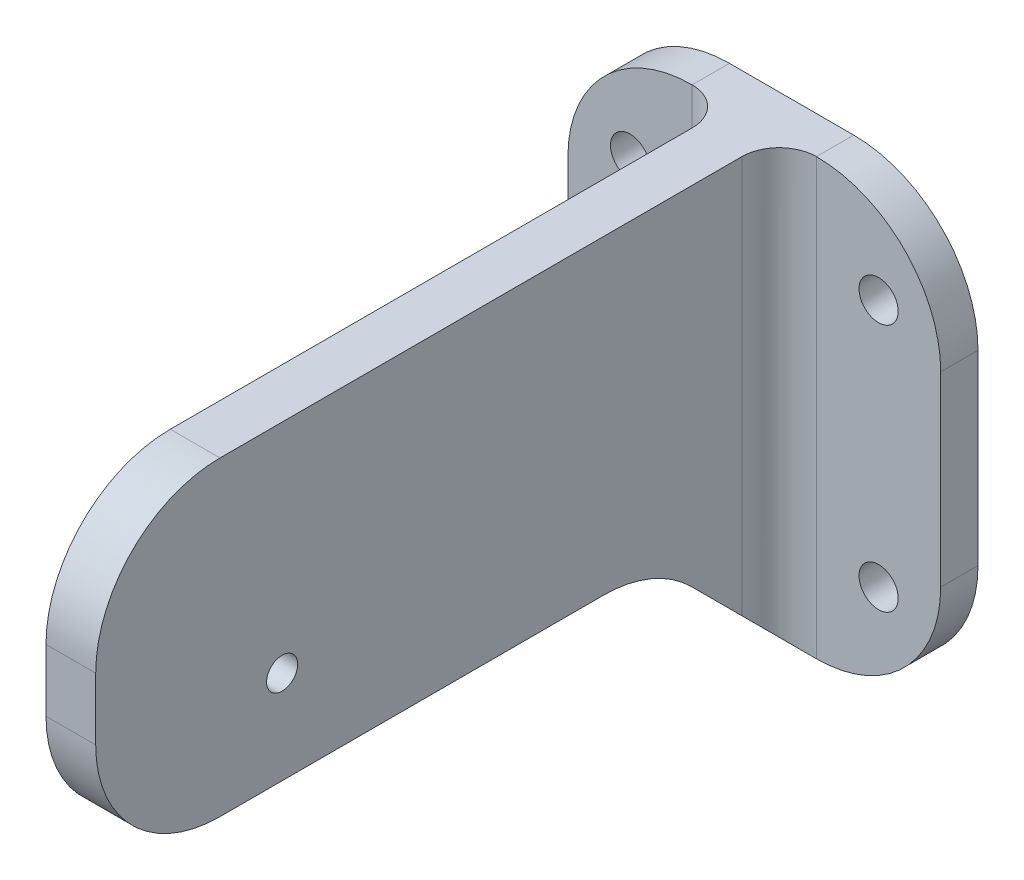
ISO-10303-21;
HEADER;
FILE_DESCRIPTION(('STEP AP214'),'2;1');
FILE_NAME('part.step','',(''),(''),'','','');
FILE_SCHEMA(('AUTOMOTIVE_DESIGN { 1 0 10303 214 1 1 1 1 }'));
ENDSEC;
DATA;
#1=APPLICATION_CONTEXT('core data for automotive mechanical design processes');
#2=APPLICATION_PROTOCOL_DEFINITION('international standard','automotive_design',2000,#1);
#3=PRODUCT_CONTEXT('',#1,'mechanical');
#4=PRODUCT('Part','Part','',(#3));
#5=PRODUCT_RELATED_PRODUCT_CATEGORY('part','',(#4));
#6=PRODUCT_DEFINITION_FORMATION('','',#4);
#7=PRODUCT_DEFINITION_CONTEXT('part definition',#1,'design');
#8=PRODUCT_DEFINITION('design','',#6,#7);
#9=PRODUCT_DEFINITION_SHAPE('','',#8);
#10=(LENGTH_UNIT() NAMED_UNIT(*) SI_UNIT(.MILLI.,.METRE.));
#11=(NAMED_UNIT(*) PLANE_ANGLE_UNIT() SI_UNIT($,.RADIAN.));
#12=(NAMED_UNIT(*) SI_UNIT($,.STERADIAN.) SOLID_ANGLE_UNIT());
#13=UNCERTAINTY_MEASURE_WITH_UNIT(LENGTH_MEASURE(1.E-05),#10,'distance_accuracy_value','');
#14=(GEOMETRIC_REPRESENTATION_CONTEXT(3) GLOBAL_UNCERTAINTY_ASSIGNED_CONTEXT((#13)) GLOBAL_UNIT_ASSIGNED_CONTEXT((#10,
#11,#12)) REPRESENTATION_CONTEXT('',''));
#15=CARTESIAN_POINT('',(0.,0.,0.));
#16=DIRECTION('',(0.,0.,1.));
#17=DIRECTION('',(1.,0.,0.));
#18=AXIS2_PLACEMENT_3D('',#15,#16,#17);
#19=CARTESIAN_POINT('',(0.,0.,3.));
#20=DIRECTION('',(0.,0.,1.));
#21=DIRECTION('',(1.,0.,0.));
#22=AXIS2_PLACEMENT_3D('',#19,#20,#21);
#23=PLANE('',#22);
#24=CARTESIAN_POINT('',(10.,10.,3.));
#25=DIRECTION('',(0.,0.,1.));
#26=DIRECTION('',(1.,0.,0.));
#27=AXIS2_PLACEMENT_3D('',#24,#25,#26);
#28=CIRCLE('',#27,1.575);
#29=CARTESIAN_POINT('',(11.575,10.,3.));
#30=VERTEX_POINT('',#29);
#31=EDGE_CURVE('E340',#30,#30,#28,.T.);
#32=ORIENTED_EDGE('',*,*,#31,.F.);
#33=EDGE_LOOP('',(#32));
#34=FACE_BOUND('',#33,.T.);
#35=CARTESIAN_POINT('',(10.,-10.,3.));
#36=DIRECTION('',(0.,0.,1.));
#37=DIRECTION('',(1.,0.,0.));
#38=AXIS2_PLACEMENT_3D('',#35,#36,#37);
#39=CIRCLE('',#38,1.575);
#40=CARTESIAN_POINT('',(11.575,-10.,3.));
#41=VERTEX_POINT('',#40);
#42=EDGE_CURVE('E337',#41,#41,#39,.T.);
#43=ORIENTED_EDGE('',*,*,#42,.F.);
#44=EDGE_LOOP('',(#43));
#45=FACE_BOUND('',#44,.T.);
#46=CARTESIAN_POINT('',(5.,7.5,3.));
#47=DIRECTION('',(0.,0.,1.));
#48=DIRECTION('',(1.,0.,0.));
#49=AXIS2_PLACEMENT_3D('',#46,#47,#48);
#50=CIRCLE('',#49,10.);
#51=CARTESIAN_POINT('',(15.,7.5,3.));
#52=VERTEX_POINT('',#51);
#53=CARTESIAN_POINT('',(5.,17.5,3.));
#54=VERTEX_POINT('',#53);
#55=EDGE_CURVE('E232',#52,#54,#50,.T.);
#56=ORIENTED_EDGE('',*,*,#55,.T.);
#57=DIRECTION('',(0.,1.,0.));
#58=VECTOR('',#57,1.);
#59=CARTESIAN_POINT('',(5.,0.,3.));
#60=LINE('',#59,#58);
#61=CARTESIAN_POINT('',(5.,-17.5,3.));
#62=VERTEX_POINT('',#61);
#63=EDGE_CURVE('E152',#54,#62,#60,.F.);
#64=ORIENTED_EDGE('',*,*,#63,.T.);
#65=CARTESIAN_POINT('',(5.,-7.5,3.));
#66=DIRECTION('',(0.,0.,1.));
#67=DIRECTION('',(1.,0.,0.));
#68=AXIS2_PLACEMENT_3D('',#65,#66,#67);
#69=CIRCLE('',#68,10.);
#70=CARTESIAN_POINT('',(15.,-7.5,3.));
#71=VERTEX_POINT('',#70);
#72=EDGE_CURVE('E234',#62,#71,#69,.T.);
#73=ORIENTED_EDGE('',*,*,#72,.T.);
#74=DIRECTION('',(0.,1.,0.));
#75=VECTOR('',#74,1.);
#76=CARTESIAN_POINT('',(15.,17.5,3.));
#77=LINE('',#76,#75);
#78=EDGE_CURVE('E184',#71,#52,#77,.T.);
#79=ORIENTED_EDGE('',*,*,#78,.T.);
#80=EDGE_LOOP('',(#56,#64,#73,#79));
#81=FACE_BOUND('',#80,.T.);
#82=ADVANCED_FACE('F35',(#34,#45,#81),#23,.T.);
#83=CARTESIAN_POINT('',(15.,17.5,3.));
#84=DIRECTION('',(-1.,0.,0.));
#85=DIRECTION('',(0.,-1.,0.));
#86=AXIS2_PLACEMENT_3D('',#83,#84,#85);
#87=PLANE('',#86);
#88=ORIENTED_EDGE('',*,*,#78,.F.);
#89=DIRECTION('',(0.,0.,-1.));
#90=VECTOR('',#89,1.);
#91=CARTESIAN_POINT('',(15.,-7.5,3.));
#92=LINE('',#91,#90);
#93=CARTESIAN_POINT('',(15.,-7.5,0.));
#94=VERTEX_POINT('',#93);
#95=EDGE_CURVE('E229',#71,#94,#92,.T.);
#96=ORIENTED_EDGE('',*,*,#95,.T.);
#97=DIRECTION('',(0.,1.,0.));
#98=VECTOR('',#97,1.);
#99=CARTESIAN_POINT('',(15.,17.5,0.));
#100=LINE('',#99,#98);
#101=CARTESIAN_POINT('',(15.,7.5,0.));
#102=VERTEX_POINT('',#101);
#103=EDGE_CURVE('E174',#94,#102,#100,.T.);
#104=ORIENTED_EDGE('',*,*,#103,.T.);
#105=DIRECTION('',(0.,0.,-1.));
#106=VECTOR('',#105,1.);
#107=CARTESIAN_POINT('',(15.,7.5,3.));
#108=LINE('',#107,#106);
#109=EDGE_CURVE('E227',#102,#52,#108,.F.);
#110=ORIENTED_EDGE('',*,*,#109,.T.);
#111=EDGE_LOOP('',(#88,#96,#104,#110));
#112=FACE_BOUND('',#111,.T.);
#113=ADVANCED_FACE('F376',(#112),#87,.F.);
#114=CARTESIAN_POINT('',(-15.,17.5,3.));
#115=DIRECTION('',(0.,-1.,0.));
#116=DIRECTION('',(0.,0.,-1.));
#117=AXIS2_PLACEMENT_3D('',#114,#115,#116);
#118=PLANE('',#117);
#119=DIRECTION('',(0.,0.,-1.));
#120=VECTOR('',#119,1.);
#121=CARTESIAN_POINT('',(2.,17.5,58.));
#122=LINE('',#121,#120);
#123=CARTESIAN_POINT('',(2.,17.5,48.));
#124=VERTEX_POINT('',#123);
#125=CARTESIAN_POINT('',(2.,17.5,6.));
#126=VERTEX_POINT('',#125);
#127=EDGE_CURVE('E164',#124,#126,#122,.T.);
#128=ORIENTED_EDGE('',*,*,#127,.T.);
#129=CARTESIAN_POINT('',(5.,17.5,6.));
#130=DIRECTION('',(0.,-1.,0.));
#131=DIRECTION('',(0.,0.,-1.));
#132=AXIS2_PLACEMENT_3D('',#129,#130,#131);
#133=CIRCLE('',#132,3.);
#134=EDGE_CURVE('E147',#126,#54,#133,.T.);
#135=ORIENTED_EDGE('',*,*,#134,.T.);
#136=DIRECTION('',(0.,0.,-1.));
#137=VECTOR('',#136,1.);
#138=CARTESIAN_POINT('',(5.,17.5,3.));
#139=LINE('',#138,#137);
#140=CARTESIAN_POINT('',(5.,17.5,0.));
#141=VERTEX_POINT('',#140);
#142=EDGE_CURVE('E238',#54,#141,#139,.T.);
#143=ORIENTED_EDGE('',*,*,#142,.T.);
#144=DIRECTION('',(-1.,0.,0.));
#145=VECTOR('',#144,1.);
#146=CARTESIAN_POINT('',(-15.,17.5,0.));
#147=LINE('',#146,#145);
#148=CARTESIAN_POINT('',(-5.,17.5,0.));
#149=VERTEX_POINT('',#148);
#150=EDGE_CURVE('E178',#141,#149,#147,.T.);
#151=ORIENTED_EDGE('',*,*,#150,.T.);
#152=DIRECTION('',(0.,0.,-1.));
#153=VECTOR('',#152,1.);
#154=CARTESIAN_POINT('',(-5.,17.5,3.));
#155=LINE('',#154,#153);
#156=CARTESIAN_POINT('',(-5.,17.5,3.));
#157=VERTEX_POINT('',#156);
#158=EDGE_CURVE('E236',#149,#157,#155,.F.);
#159=ORIENTED_EDGE('',*,*,#158,.T.);
#160=CARTESIAN_POINT('',(-5.,17.5,6.));
#161=DIRECTION('',(0.,-1.,0.));
#162=DIRECTION('',(0.,0.,-1.));
#163=AXIS2_PLACEMENT_3D('',#160,#161,#162);
#164=CIRCLE('',#163,3.);
#165=CARTESIAN_POINT('',(-2.,17.5,6.));
#166=VERTEX_POINT('',#165);
#167=EDGE_CURVE('E11',#157,#166,#164,.T.);
#168=ORIENTED_EDGE('',*,*,#167,.T.);
#169=DIRECTION('',(0.,0.,-1.));
#170=VECTOR('',#169,1.);
#171=CARTESIAN_POINT('',(-2.,17.5,58.));
#172=LINE('',#171,#170);
#173=CARTESIAN_POINT('',(-2.,17.5,48.));
#174=VERTEX_POINT('',#173);
#175=EDGE_CURVE('E175',#174,#166,#172,.T.);
#176=ORIENTED_EDGE('',*,*,#175,.F.);
#177=DIRECTION('',(-1.,0.,0.));
#178=VECTOR('',#177,1.);
#179=CARTESIAN_POINT('',(2.,17.5,48.));
#180=LINE('',#179,#178);
#181=EDGE_CURVE('E173',#174,#124,#180,.F.);
#182=ORIENTED_EDGE('',*,*,#181,.T.);
#183=EDGE_LOOP('',(#128,#135,#143,#151,#159,#168,#176,#182));
#184=FACE_BOUND('',#183,.T.);
#185=ADVANCED_FACE('F171',(#184),#118,.F.);
#186=CARTESIAN_POINT('',(-15.,17.5,3.));
#187=DIRECTION('',(1.,0.,0.));
#188=DIRECTION('',(0.,1.,0.));
#189=AXIS2_PLACEMENT_3D('',#186,#187,#188);
#190=PLANE('',#189);
#191=DIRECTION('',(0.,-1.,0.));
#192=VECTOR('',#191,1.);
#193=CARTESIAN_POINT('',(-15.,17.5,0.));
#194=LINE('',#193,#192);
#195=CARTESIAN_POINT('',(-15.,7.5,0.));
#196=VERTEX_POINT('',#195);
#197=CARTESIAN_POINT('',(-15.,-7.5,0.));
#198=VERTEX_POINT('',#197);
#199=EDGE_CURVE('E194',#196,#198,#194,.T.);
#200=ORIENTED_EDGE('',*,*,#199,.T.);
#201=DIRECTION('',(0.,0.,-1.));
#202=VECTOR('',#201,1.);
#203=CARTESIAN_POINT('',(-15.,-7.5,3.));
#204=LINE('',#203,#202);
#205=CARTESIAN_POINT('',(-15.,-7.5,3.));
#206=VERTEX_POINT('',#205);
#207=EDGE_CURVE('E220',#198,#206,#204,.F.);
#208=ORIENTED_EDGE('',*,*,#207,.T.);
#209=DIRECTION('',(0.,-1.,0.));
#210=VECTOR('',#209,1.);
#211=CARTESIAN_POINT('',(-15.,17.5,3.));
#212=LINE('',#211,#210);
#213=CARTESIAN_POINT('',(-15.,7.5,3.));
#214=VERTEX_POINT('',#213);
#215=EDGE_CURVE('E187',#214,#206,#212,.T.);
#216=ORIENTED_EDGE('',*,*,#215,.F.);
#217=DIRECTION('',(0.,0.,-1.));
#218=VECTOR('',#217,1.);
#219=CARTESIAN_POINT('',(-15.,7.5,3.));
#220=LINE('',#219,#218);
#221=EDGE_CURVE('E217',#214,#196,#220,.T.);
#222=ORIENTED_EDGE('',*,*,#221,.T.);
#223=EDGE_LOOP('',(#200,#208,#216,#222));
#224=FACE_BOUND('',#223,.T.);
#225=ADVANCED_FACE('F302',(#224),#190,.F.);
#226=CARTESIAN_POINT('',(-15.,-17.5,3.));
#227=DIRECTION('',(0.,1.,0.));
#228=DIRECTION('',(0.,0.,1.));
#229=AXIS2_PLACEMENT_3D('',#226,#227,#228);
#230=PLANE('',#229);
#231=DIRECTION('',(0.,0.,-1.));
#232=VECTOR('',#231,1.);
#233=CARTESIAN_POINT('',(5.,-17.5,3.));
#234=LINE('',#233,#232);
#235=CARTESIAN_POINT('',(5.,-17.5,0.));
#236=VERTEX_POINT('',#235);
#237=EDGE_CURVE('E206',#236,#62,#234,.F.);
#238=ORIENTED_EDGE('',*,*,#237,.T.);
#239=DIRECTION('',(1.,0.,0.));
#240=VECTOR('',#239,1.);
#241=CARTESIAN_POINT('',(-53.,-17.5,3.));
#242=LINE('',#241,#240);
#243=CARTESIAN_POINT('',(-5.,-17.5,3.));
#244=VERTEX_POINT('',#243);
#245=EDGE_CURVE('E50',#244,#62,#242,.T.);
#246=ORIENTED_EDGE('',*,*,#245,.F.);
#247=DIRECTION('',(0.,0.,-1.));
#248=VECTOR('',#247,1.);
#249=CARTESIAN_POINT('',(-5.,-17.5,3.));
#250=LINE('',#249,#248);
#251=CARTESIAN_POINT('',(-5.,-17.5,0.));
#252=VERTEX_POINT('',#251);
#253=EDGE_CURVE('E208',#244,#252,#250,.T.);
#254=ORIENTED_EDGE('',*,*,#253,.T.);
#255=DIRECTION('',(1.,0.,0.));
#256=VECTOR('',#255,1.);
#257=CARTESIAN_POINT('',(-15.,-17.5,0.));
#258=LINE('',#257,#256);
#259=EDGE_CURVE('E188',#252,#236,#258,.T.);
#260=ORIENTED_EDGE('',*,*,#259,.T.);
#261=EDGE_LOOP('',(#238,#246,#254,#260));
#262=FACE_BOUND('',#261,.T.);
#263=ADVANCED_FACE('F307',(#262),#230,.F.);
#264=CARTESIAN_POINT('',(-10.,-10.,3.));
#265=DIRECTION('',(0.,0.,1.));
#266=DIRECTION('',(1.,0.,0.));
#267=AXIS2_PLACEMENT_3D('',#264,#265,#266);
#268=CIRCLE('',#267,1.575);
#269=CARTESIAN_POINT('',(-8.425,-10.,3.));
#270=VERTEX_POINT('',#269);
#271=EDGE_CURVE('E258',#270,#270,#268,.T.);
#272=ORIENTED_EDGE('',*,*,#271,.F.);
#273=EDGE_LOOP('',(#272));
#274=FACE_BOUND('',#273,.T.);
#275=CARTESIAN_POINT('',(-10.,10.,3.));
#276=DIRECTION('',(0.,0.,1.));
#277=DIRECTION('',(1.,0.,0.));
#278=AXIS2_PLACEMENT_3D('',#275,#276,#277);
#279=CIRCLE('',#278,1.575);
#280=CARTESIAN_POINT('',(-8.425,10.,3.));
#281=VERTEX_POINT('',#280);
#282=EDGE_CURVE('E245',#281,#281,#279,.T.);
#283=ORIENTED_EDGE('',*,*,#282,.F.);
#284=EDGE_LOOP('',(#283));
#285=FACE_BOUND('',#284,.T.);
#286=CARTESIAN_POINT('',(-5.,-7.5,3.));
#287=DIRECTION('',(0.,0.,1.));
#288=DIRECTION('',(1.,0.,0.));
#289=AXIS2_PLACEMENT_3D('',#286,#287,#288);
#290=CIRCLE('',#289,10.);
#291=EDGE_CURVE('E224',#206,#244,#290,.T.);
#292=ORIENTED_EDGE('',*,*,#291,.T.);
#293=DIRECTION('',(0.,-1.,0.));
#294=VECTOR('',#293,1.);
#295=CARTESIAN_POINT('',(-5.,0.,3.));
#296=LINE('',#295,#294);
#297=EDGE_CURVE('E157',#244,#157,#296,.F.);
#298=ORIENTED_EDGE('',*,*,#297,.T.);
#299=CARTESIAN_POINT('',(-5.,7.5,3.));
#300=DIRECTION('',(0.,0.,1.));
#301=DIRECTION('',(1.,0.,0.));
#302=AXIS2_PLACEMENT_3D('',#299,#300,#301);
#303=CIRCLE('',#302,10.);
#304=EDGE_CURVE('E222',#157,#214,#303,.T.);
#305=ORIENTED_EDGE('',*,*,#304,.T.);
#306=ORIENTED_EDGE('',*,*,#215,.T.);
#307=EDGE_LOOP('',(#292,#298,#305,#306));
#308=FACE_BOUND('',#307,.T.);
#309=ADVANCED_FACE('F291',(#274,#285,#308),#23,.T.);
#310=CARTESIAN_POINT('',(0.,0.,0.));
#311=DIRECTION('',(0.,0.,1.));
#312=DIRECTION('',(1.,0.,0.));
#313=AXIS2_PLACEMENT_3D('',#310,#311,#312);
#314=PLANE('',#313);
#315=CARTESIAN_POINT('',(-10.,-10.,0.));
#316=DIRECTION('',(0.,0.,1.));
#317=DIRECTION('',(1.,0.,0.));
#318=AXIS2_PLACEMENT_3D('',#315,#316,#317);
#319=CIRCLE('',#318,1.575);
#320=CARTESIAN_POINT('',(-8.425,-10.,0.));
#321=VERTEX_POINT('',#320);
#322=EDGE_CURVE('E251',#321,#321,#319,.T.);
#323=ORIENTED_EDGE('',*,*,#322,.T.);
#324=EDGE_LOOP('',(#323));
#325=FACE_BOUND('',#324,.T.);
#326=CARTESIAN_POINT('',(10.,10.,0.));
#327=DIRECTION('',(0.,0.,1.));
#328=DIRECTION('',(1.,0.,0.));
#329=AXIS2_PLACEMENT_3D('',#326,#327,#328);
#330=CIRCLE('',#329,1.575);
#331=CARTESIAN_POINT('',(11.575,10.,0.));
#332=VERTEX_POINT('',#331);
#333=EDGE_CURVE('E248',#332,#332,#330,.T.);
#334=ORIENTED_EDGE('',*,*,#333,.T.);
#335=EDGE_LOOP('',(#334));
#336=FACE_BOUND('',#335,.T.);
#337=CARTESIAN_POINT('',(10.,-10.,0.));
#338=DIRECTION('',(0.,0.,1.));
#339=DIRECTION('',(1.,0.,0.));
#340=AXIS2_PLACEMENT_3D('',#337,#338,#339);
#341=CIRCLE('',#340,1.575);
#342=CARTESIAN_POINT('',(11.575,-10.,0.));
#343=VERTEX_POINT('',#342);
#344=EDGE_CURVE('E244',#343,#343,#341,.T.);
#345=ORIENTED_EDGE('',*,*,#344,.T.);
#346=EDGE_LOOP('',(#345));
#347=FACE_BOUND('',#346,.T.);
#348=CARTESIAN_POINT('',(-10.,10.,0.));
#349=DIRECTION('',(0.,0.,1.));
#350=DIRECTION('',(1.,0.,0.));
#351=AXIS2_PLACEMENT_3D('',#348,#349,#350);
#352=CIRCLE('',#351,1.575);
#353=CARTESIAN_POINT('',(-8.425,10.,0.));
#354=VERTEX_POINT('',#353);
#355=EDGE_CURVE('E241',#354,#354,#352,.T.);
#356=ORIENTED_EDGE('',*,*,#355,.T.);
#357=EDGE_LOOP('',(#356));
#358=FACE_BOUND('',#357,.T.);
#359=ORIENTED_EDGE('',*,*,#259,.F.);
#360=CARTESIAN_POINT('',(-5.,-7.5,0.));
#361=DIRECTION('',(0.,0.,1.));
#362=DIRECTION('',(1.,0.,0.));
#363=AXIS2_PLACEMENT_3D('',#360,#361,#362);
#364=CIRCLE('',#363,10.);
#365=EDGE_CURVE('E215',#252,#198,#364,.F.);
#366=ORIENTED_EDGE('',*,*,#365,.T.);
#367=ORIENTED_EDGE('',*,*,#199,.F.);
#368=CARTESIAN_POINT('',(-5.,7.5,0.));
#369=DIRECTION('',(0.,0.,1.));
#370=DIRECTION('',(1.,0.,0.));
#371=AXIS2_PLACEMENT_3D('',#368,#369,#370);
#372=CIRCLE('',#371,10.);
#373=EDGE_CURVE('E210',#196,#149,#372,.F.);
#374=ORIENTED_EDGE('',*,*,#373,.T.);
#375=ORIENTED_EDGE('',*,*,#150,.F.);
#376=CARTESIAN_POINT('',(5.,7.5,0.));
#377=DIRECTION('',(0.,0.,1.));
#378=DIRECTION('',(1.,0.,0.));
#379=AXIS2_PLACEMENT_3D('',#376,#377,#378);
#380=CIRCLE('',#379,10.);
#381=EDGE_CURVE('E212',#141,#102,#380,.F.);
#382=ORIENTED_EDGE('',*,*,#381,.T.);
#383=ORIENTED_EDGE('',*,*,#103,.F.);
#384=CARTESIAN_POINT('',(5.,-7.5,0.));
#385=DIRECTION('',(0.,0.,1.));
#386=DIRECTION('',(1.,0.,0.));
#387=AXIS2_PLACEMENT_3D('',#384,#385,#386);
#388=CIRCLE('',#387,10.);
#389=EDGE_CURVE('E79',#94,#236,#388,.F.);
#390=ORIENTED_EDGE('',*,*,#389,.T.);
#391=EDGE_LOOP('',(#359,#366,#367,#374,#375,#382,#383,#390));
#392=FACE_BOUND('',#391,.T.);
#393=ADVANCED_FACE('F304',(#325,#336,#347,#358,#392),#314,.F.);
#394=CARTESIAN_POINT('',(2.,17.5,58.));
#395=DIRECTION('',(-1.,0.,0.));
#396=DIRECTION('',(0.,0.,1.));
#397=AXIS2_PLACEMENT_3D('',#394,#395,#396);
#398=PLANE('',#397);
#399=CARTESIAN_POINT('',(2.,0.,43.));
#400=DIRECTION('',(1.,0.,0.));
#401=DIRECTION('',(0.,0.,-1.));
#402=AXIS2_PLACEMENT_3D('',#399,#400,#401);
#403=CIRCLE('',#402,1.25);
#404=CARTESIAN_POINT('',(2.,0.,41.75));
#405=VERTEX_POINT('',#404);
#406=EDGE_CURVE('E259',#405,#405,#403,.T.);
#407=ORIENTED_EDGE('',*,*,#406,.F.);
#408=EDGE_LOOP('',(#407));
#409=FACE_BOUND('',#408,.T.);
#410=DIRECTION('',(0.,0.707106781186547,0.707106781186548));
#411=VECTOR('',#410,1.);
#412=CARTESIAN_POINT('',(2.,-7.5,13.));
#413=LINE('',#412,#411);
#414=CARTESIAN_POINT('',(2.,-14.5,6.));
#415=VERTEX_POINT('',#414);
#416=CARTESIAN_POINT('',(2.,-10.4289321881345,10.0710678118655));
#417=VERTEX_POINT('',#416);
#418=EDGE_CURVE('E167',#415,#417,#413,.T.);
#419=ORIENTED_EDGE('',*,*,#418,.F.);
#420=DIRECTION('',(0.,1.,0.));
#421=VECTOR('',#420,1.);
#422=CARTESIAN_POINT('',(2.,17.5,6.));
#423=LINE('',#422,#421);
#424=EDGE_CURVE('E151',#415,#126,#423,.T.);
#425=ORIENTED_EDGE('',*,*,#424,.T.);
#426=ORIENTED_EDGE('',*,*,#127,.F.);
#427=CARTESIAN_POINT('',(2.,7.5,48.));
#428=DIRECTION('',(-1.,0.,0.));
#429=DIRECTION('',(0.,0.,1.));
#430=AXIS2_PLACEMENT_3D('',#427,#428,#429);
#431=CIRCLE('',#430,10.);
#432=CARTESIAN_POINT('',(2.,7.5,58.));
#433=VERTEX_POINT('',#432);
#434=EDGE_CURVE('E204',#124,#433,#431,.F.);
#435=ORIENTED_EDGE('',*,*,#434,.T.);
#436=DIRECTION('',(0.,1.,0.));
#437=VECTOR('',#436,1.);
#438=CARTESIAN_POINT('',(2.,17.5,58.));
#439=LINE('',#438,#437);
#440=CARTESIAN_POINT('',(2.,2.5,58.));
#441=VERTEX_POINT('',#440);
#442=EDGE_CURVE('E254',#441,#433,#439,.T.);
#443=ORIENTED_EDGE('',*,*,#442,.F.);
#444=CARTESIAN_POINT('',(2.,2.49999999999999,48.));
#445=DIRECTION('',(-1.,0.,0.));
#446=DIRECTION('',(0.,0.,1.));
#447=AXIS2_PLACEMENT_3D('',#444,#445,#446);
#448=CIRCLE('',#447,10.);
#449=CARTESIAN_POINT('',(2.,-7.50000000000001,48.));
#450=VERTEX_POINT('',#449);
#451=EDGE_CURVE('E262',#441,#450,#448,.F.);
#452=ORIENTED_EDGE('',*,*,#451,.T.);
#453=DIRECTION('',(0.,0.,1.));
#454=VECTOR('',#453,1.);
#455=CARTESIAN_POINT('',(2.,-7.5,13.));
#456=LINE('',#455,#454);
#457=CARTESIAN_POINT('',(2.,-7.5,17.142135623731));
#458=VERTEX_POINT('',#457);
#459=EDGE_CURVE('E319',#458,#450,#456,.T.);
#460=ORIENTED_EDGE('',*,*,#459,.F.);
#461=CARTESIAN_POINT('',(2.,-17.5,17.142135623731));
#462=DIRECTION('',(-1.,0.,0.));
#463=DIRECTION('',(0.,0.,1.));
#464=AXIS2_PLACEMENT_3D('',#461,#462,#463);
#465=CIRCLE('',#464,10.);
#466=EDGE_CURVE('E276',#458,#417,#465,.T.);
#467=ORIENTED_EDGE('',*,*,#466,.T.);
#468=EDGE_LOOP('',(#419,#425,#426,#435,#443,#452,#460,#467));
#469=FACE_BOUND('',#468,.T.);
#470=ADVANCED_FACE('F162',(#409,#469),#398,.F.);
#471=CARTESIAN_POINT('',(-2.,17.5,58.));
#472=DIRECTION('',(1.,0.,0.));
#473=DIRECTION('',(0.,0.,-1.));
#474=AXIS2_PLACEMENT_3D('',#471,#472,#473);
#475=PLANE('',#474);
#476=CARTESIAN_POINT('',(-2.,0.,43.));
#477=DIRECTION('',(1.,0.,0.));
#478=DIRECTION('',(0.,0.,-1.));
#479=AXIS2_PLACEMENT_3D('',#476,#477,#478);
#480=CIRCLE('',#479,1.25);
#481=CARTESIAN_POINT('',(-2.,0.,41.75));
#482=VERTEX_POINT('',#481);
#483=EDGE_CURVE('E255',#482,#482,#480,.T.);
#484=ORIENTED_EDGE('',*,*,#483,.T.);
#485=EDGE_LOOP('',(#484));
#486=FACE_BOUND('',#485,.T.);
#487=ORIENTED_EDGE('',*,*,#175,.T.);
#488=DIRECTION('',(0.,-1.,0.));
#489=VECTOR('',#488,1.);
#490=CARTESIAN_POINT('',(-2.,17.5,6.));
#491=LINE('',#490,#489);
#492=CARTESIAN_POINT('',(-2.,-14.5,6.));
#493=VERTEX_POINT('',#492);
#494=EDGE_CURVE('E280',#166,#493,#491,.T.);
#495=ORIENTED_EDGE('',*,*,#494,.T.);
#496=DIRECTION('',(0.,0.707106781186547,0.707106781186548));
#497=VECTOR('',#496,1.);
#498=CARTESIAN_POINT('',(-2.,27.5,48.));
#499=LINE('',#498,#497);
#500=CARTESIAN_POINT('',(-2.,-10.4289321881345,10.0710678118655));
#501=VERTEX_POINT('',#500);
#502=EDGE_CURVE('E287',#493,#501,#499,.T.);
#503=ORIENTED_EDGE('',*,*,#502,.T.);
#504=CARTESIAN_POINT('',(-2.,-17.5,17.142135623731));
#505=DIRECTION('',(1.,0.,0.));
#506=DIRECTION('',(0.,0.,-1.));
#507=AXIS2_PLACEMENT_3D('',#504,#505,#506);
#508=CIRCLE('',#507,10.);
#509=CARTESIAN_POINT('',(-2.,-7.5,17.142135623731));
#510=VERTEX_POINT('',#509);
#511=EDGE_CURVE('E168',#501,#510,#508,.T.);
#512=ORIENTED_EDGE('',*,*,#511,.T.);
#513=DIRECTION('',(0.,0.,1.));
#514=VECTOR('',#513,1.);
#515=CARTESIAN_POINT('',(-2.,-7.50000000000001,58.));
#516=LINE('',#515,#514);
#517=CARTESIAN_POINT('',(-2.,-7.50000000000001,48.));
#518=VERTEX_POINT('',#517);
#519=EDGE_CURVE('E326',#510,#518,#516,.T.);
#520=ORIENTED_EDGE('',*,*,#519,.T.);
#521=CARTESIAN_POINT('',(-2.,2.49999999999999,48.));
#522=DIRECTION('',(1.,0.,0.));
#523=DIRECTION('',(0.,0.,-1.));
#524=AXIS2_PLACEMENT_3D('',#521,#522,#523);
#525=CIRCLE('',#524,10.);
#526=CARTESIAN_POINT('',(-2.,2.5,58.));
#527=VERTEX_POINT('',#526);
#528=EDGE_CURVE('E268',#518,#527,#525,.F.);
#529=ORIENTED_EDGE('',*,*,#528,.T.);
#530=DIRECTION('',(0.,-1.,0.));
#531=VECTOR('',#530,1.);
#532=CARTESIAN_POINT('',(-2.,17.5,58.));
#533=LINE('',#532,#531);
#534=CARTESIAN_POINT('',(-2.,7.5,58.));
#535=VERTEX_POINT('',#534);
#536=EDGE_CURVE('E180',#535,#527,#533,.T.);
#537=ORIENTED_EDGE('',*,*,#536,.F.);
#538=CARTESIAN_POINT('',(-2.,7.5,48.));
#539=DIRECTION('',(1.,0.,0.));
#540=DIRECTION('',(0.,0.,-1.));
#541=AXIS2_PLACEMENT_3D('',#538,#539,#540);
#542=CIRCLE('',#541,10.);
#543=EDGE_CURVE('E200',#535,#174,#542,.F.);
#544=ORIENTED_EDGE('',*,*,#543,.T.);
#545=EDGE_LOOP('',(#487,#495,#503,#512,#520,#529,#537,#544));
#546=FACE_BOUND('',#545,.T.);
#547=ADVANCED_FACE('F325',(#486,#546),#475,.F.);
#548=CARTESIAN_POINT('',(0.,0.,58.));
#549=DIRECTION('',(0.,0.,1.));
#550=DIRECTION('',(1.,0.,0.));
#551=AXIS2_PLACEMENT_3D('',#548,#549,#550);
#552=PLANE('',#551);
#553=ORIENTED_EDGE('',*,*,#536,.T.);
#554=DIRECTION('',(1.,0.,0.));
#555=VECTOR('',#554,1.);
#556=CARTESIAN_POINT('',(2.,2.49999999999999,58.));
#557=LINE('',#556,#555);
#558=EDGE_CURVE('E240',#527,#441,#557,.T.);
#559=ORIENTED_EDGE('',*,*,#558,.T.);
#560=ORIENTED_EDGE('',*,*,#442,.T.);
#561=DIRECTION('',(-1.,0.,0.));
#562=VECTOR('',#561,1.);
#563=CARTESIAN_POINT('',(-2.,7.5,58.));
#564=LINE('',#563,#562);
#565=EDGE_CURVE('E190',#433,#535,#564,.T.);
#566=ORIENTED_EDGE('',*,*,#565,.T.);
#567=EDGE_LOOP('',(#553,#559,#560,#566));
#568=FACE_BOUND('',#567,.T.);
#569=ADVANCED_FACE('F352',(#568),#552,.T.);
#570=CARTESIAN_POINT('',(0.,7.5,48.));
#571=DIRECTION('',(1.,0.,0.));
#572=DIRECTION('',(0.,0.,-1.));
#573=AXIS2_PLACEMENT_3D('',#570,#571,#572);
#574=CYLINDRICAL_SURFACE('',#573,10.);
#575=ORIENTED_EDGE('',*,*,#434,.F.);
#576=ORIENTED_EDGE('',*,*,#181,.F.);
#577=ORIENTED_EDGE('',*,*,#543,.F.);
#578=ORIENTED_EDGE('',*,*,#565,.F.);
#579=EDGE_LOOP('',(#575,#576,#577,#578));
#580=FACE_BOUND('',#579,.T.);
#581=ADVANCED_FACE('F365',(#580),#574,.T.);
#582=CARTESIAN_POINT('',(-5.,-7.5,3.));
#583=DIRECTION('',(0.,0.,-1.));
#584=DIRECTION('',(-1.,0.,0.));
#585=AXIS2_PLACEMENT_3D('',#582,#583,#584);
#586=CYLINDRICAL_SURFACE('',#585,10.);
#587=ORIENTED_EDGE('',*,*,#291,.F.);
#588=ORIENTED_EDGE('',*,*,#207,.F.);
#589=ORIENTED_EDGE('',*,*,#365,.F.);
#590=ORIENTED_EDGE('',*,*,#253,.F.);
#591=EDGE_LOOP('',(#587,#588,#589,#590));
#592=FACE_BOUND('',#591,.T.);
#593=ADVANCED_FACE('F306',(#592),#586,.T.);
#594=CARTESIAN_POINT('',(5.,-7.5,3.));
#595=DIRECTION('',(0.,0.,-1.));
#596=DIRECTION('',(-1.,0.,0.));
#597=AXIS2_PLACEMENT_3D('',#594,#595,#596);
#598=CYLINDRICAL_SURFACE('',#597,10.);
#599=ORIENTED_EDGE('',*,*,#72,.F.);
#600=ORIENTED_EDGE('',*,*,#237,.F.);
#601=ORIENTED_EDGE('',*,*,#389,.F.);
#602=ORIENTED_EDGE('',*,*,#95,.F.);
#603=EDGE_LOOP('',(#599,#600,#601,#602));
#604=FACE_BOUND('',#603,.T.);
#605=ADVANCED_FACE('F311',(#604),#598,.T.);
#606=CARTESIAN_POINT('',(5.,7.5,3.));
#607=DIRECTION('',(0.,0.,-1.));
#608=DIRECTION('',(-1.,0.,0.));
#609=AXIS2_PLACEMENT_3D('',#606,#607,#608);
#610=CYLINDRICAL_SURFACE('',#609,10.);
#611=ORIENTED_EDGE('',*,*,#55,.F.);
#612=ORIENTED_EDGE('',*,*,#109,.F.);
#613=ORIENTED_EDGE('',*,*,#381,.F.);
#614=ORIENTED_EDGE('',*,*,#142,.F.);
#615=EDGE_LOOP('',(#611,#612,#613,#614));
#616=FACE_BOUND('',#615,.T.);
#617=ADVANCED_FACE('F413',(#616),#610,.T.);
#618=CARTESIAN_POINT('',(-5.,7.5,3.));
#619=DIRECTION('',(0.,0.,-1.));
#620=DIRECTION('',(-1.,0.,0.));
#621=AXIS2_PLACEMENT_3D('',#618,#619,#620);
#622=CYLINDRICAL_SURFACE('',#621,10.);
#623=ORIENTED_EDGE('',*,*,#304,.F.);
#624=ORIENTED_EDGE('',*,*,#158,.F.);
#625=ORIENTED_EDGE('',*,*,#373,.F.);
#626=ORIENTED_EDGE('',*,*,#221,.F.);
#627=EDGE_LOOP('',(#623,#624,#625,#626));
#628=FACE_BOUND('',#627,.T.);
#629=ADVANCED_FACE('F299',(#628),#622,.T.);
#630=CARTESIAN_POINT('',(-10.,10.,-52.));
#631=DIRECTION('',(0.,0.,1.));
#632=DIRECTION('',(1.,0.,0.));
#633=AXIS2_PLACEMENT_3D('',#630,#631,#632);
#634=CYLINDRICAL_SURFACE('',#633,1.575);
#635=ORIENTED_EDGE('',*,*,#282,.T.);
#636=EDGE_LOOP('',(#635));
#637=FACE_BOUND('',#636,.T.);
#638=ORIENTED_EDGE('',*,*,#355,.F.);
#639=EDGE_LOOP('',(#638));
#640=FACE_BOUND('',#639,.T.);
#641=ADVANCED_FACE('F399',(#637,#640),#634,.F.);
#642=CARTESIAN_POINT('',(10.,-10.,-52.));
#643=DIRECTION('',(0.,0.,1.));
#644=DIRECTION('',(1.,0.,0.));
#645=AXIS2_PLACEMENT_3D('',#642,#643,#644);
#646=CYLINDRICAL_SURFACE('',#645,1.575);
#647=ORIENTED_EDGE('',*,*,#42,.T.);
#648=EDGE_LOOP('',(#647));
#649=FACE_BOUND('',#648,.T.);
#650=ORIENTED_EDGE('',*,*,#344,.F.);
#651=EDGE_LOOP('',(#650));
#652=FACE_BOUND('',#651,.T.);
#653=ADVANCED_FACE('F402',(#649,#652),#646,.F.);
#654=CARTESIAN_POINT('',(10.,10.,-52.));
#655=DIRECTION('',(0.,0.,1.));
#656=DIRECTION('',(1.,0.,0.));
#657=AXIS2_PLACEMENT_3D('',#654,#655,#656);
#658=CYLINDRICAL_SURFACE('',#657,1.575);
#659=ORIENTED_EDGE('',*,*,#31,.T.);
#660=EDGE_LOOP('',(#659));
#661=FACE_BOUND('',#660,.T.);
#662=ORIENTED_EDGE('',*,*,#333,.F.);
#663=EDGE_LOOP('',(#662));
#664=FACE_BOUND('',#663,.T.);
#665=ADVANCED_FACE('F410',(#661,#664),#658,.F.);
#666=CARTESIAN_POINT('',(-10.,-10.,-52.));
#667=DIRECTION('',(0.,0.,1.));
#668=DIRECTION('',(1.,0.,0.));
#669=AXIS2_PLACEMENT_3D('',#666,#667,#668);
#670=CYLINDRICAL_SURFACE('',#669,1.575);
#671=ORIENTED_EDGE('',*,*,#271,.T.);
#672=EDGE_LOOP('',(#671));
#673=FACE_BOUND('',#672,.T.);
#674=ORIENTED_EDGE('',*,*,#322,.F.);
#675=EDGE_LOOP('',(#674));
#676=FACE_BOUND('',#675,.T.);
#677=ADVANCED_FACE('F416',(#673,#676),#670,.F.);
#678=CARTESIAN_POINT('',(-53.,0.,43.));
#679=DIRECTION('',(1.,0.,0.));
#680=DIRECTION('',(0.,0.,-1.));
#681=AXIS2_PLACEMENT_3D('',#678,#679,#680);
#682=CYLINDRICAL_SURFACE('',#681,1.25);
#683=ORIENTED_EDGE('',*,*,#406,.T.);
#684=EDGE_LOOP('',(#683));
#685=FACE_BOUND('',#684,.T.);
#686=ORIENTED_EDGE('',*,*,#483,.F.);
#687=EDGE_LOOP('',(#686));
#688=FACE_BOUND('',#687,.T.);
#689=ADVANCED_FACE('F427',(#685,#688),#682,.F.);
#690=CARTESIAN_POINT('',(-53.,-7.5,13.));
#691=DIRECTION('',(0.,1.,0.));
#692=DIRECTION('',(0.,0.,1.));
#693=AXIS2_PLACEMENT_3D('',#690,#691,#692);
#694=PLANE('',#693);
#695=ORIENTED_EDGE('',*,*,#519,.F.);
#696=DIRECTION('',(1.,0.,0.));
#697=VECTOR('',#696,1.);
#698=CARTESIAN_POINT('',(2.,-7.5,17.142135623731));
#699=LINE('',#698,#697);
#700=EDGE_CURVE('E270',#510,#458,#699,.T.);
#701=ORIENTED_EDGE('',*,*,#700,.T.);
#702=ORIENTED_EDGE('',*,*,#459,.T.);
#703=DIRECTION('',(1.,0.,0.));
#704=VECTOR('',#703,1.);
#705=CARTESIAN_POINT('',(-2.,-7.50000000000001,48.));
#706=LINE('',#705,#704);
#707=EDGE_CURVE('E265',#450,#518,#706,.F.);
#708=ORIENTED_EDGE('',*,*,#707,.T.);
#709=EDGE_LOOP('',(#695,#701,#702,#708));
#710=FACE_BOUND('',#709,.T.);
#711=ADVANCED_FACE('F328',(#710),#694,.F.);
#712=CARTESIAN_POINT('',(0.,2.49999999999999,48.));
#713=DIRECTION('',(-1.,0.,0.));
#714=DIRECTION('',(0.,0.,1.));
#715=AXIS2_PLACEMENT_3D('',#712,#713,#714);
#716=CYLINDRICAL_SURFACE('',#715,10.);
#717=ORIENTED_EDGE('',*,*,#528,.F.);
#718=ORIENTED_EDGE('',*,*,#707,.F.);
#719=ORIENTED_EDGE('',*,*,#451,.F.);
#720=ORIENTED_EDGE('',*,*,#558,.F.);
#721=EDGE_LOOP('',(#717,#718,#719,#720));
#722=FACE_BOUND('',#721,.T.);
#723=ADVANCED_FACE('F357',(#722),#716,.T.);
#724=CARTESIAN_POINT('',(-53.,-7.5,13.));
#725=DIRECTION('',(0.,0.707106781186548,-0.707106781186547));
#726=DIRECTION('',(0.,0.707106781186547,0.707106781186548));
#727=AXIS2_PLACEMENT_3D('',#724,#725,#726);
#728=PLANE('',#727);
#729=ORIENTED_EDGE('',*,*,#245,.T.);
#730=CARTESIAN_POINT('',(5.,-14.5,6.));
#731=DIRECTION('',(0.,0.707106781186548,-0.707106781186547));
#732=DIRECTION('',(0.,0.707106781186547,0.707106781186548));
#733=AXIS2_PLACEMENT_3D('',#730,#731,#732);
#734=ELLIPSE('',#733,4.24264068711928,3.);
#735=EDGE_CURVE('E156',#62,#415,#734,.T.);
#736=ORIENTED_EDGE('',*,*,#735,.T.);
#737=ORIENTED_EDGE('',*,*,#418,.T.);
#738=DIRECTION('',(1.,0.,0.));
#739=VECTOR('',#738,1.);
#740=CARTESIAN_POINT('',(-2.,-10.4289321881345,10.0710678118655));
#741=LINE('',#740,#739);
#742=EDGE_CURVE('E273',#417,#501,#741,.F.);
#743=ORIENTED_EDGE('',*,*,#742,.T.);
#744=ORIENTED_EDGE('',*,*,#502,.F.);
#745=CARTESIAN_POINT('',(-5.,-14.5,6.));
#746=DIRECTION('',(0.,0.707106781186548,-0.707106781186547));
#747=DIRECTION('',(0.,-0.707106781186547,-0.707106781186548));
#748=AXIS2_PLACEMENT_3D('',#745,#746,#747);
#749=ELLIPSE('',#748,4.24264068711928,3.);
#750=EDGE_CURVE('E43',#493,#244,#749,.T.);
#751=ORIENTED_EDGE('',*,*,#750,.T.);
#752=EDGE_LOOP('',(#729,#736,#737,#743,#744,#751));
#753=FACE_BOUND('',#752,.T.);
#754=ADVANCED_FACE('F286',(#753),#728,.F.);
#755=CARTESIAN_POINT('',(-53.,-17.5,17.142135623731));
#756=DIRECTION('',(-1.,0.,0.));
#757=DIRECTION('',(0.,0.,1.));
#758=AXIS2_PLACEMENT_3D('',#755,#756,#757);
#759=CYLINDRICAL_SURFACE('',#758,10.);
#760=ORIENTED_EDGE('',*,*,#511,.F.);
#761=ORIENTED_EDGE('',*,*,#742,.F.);
#762=ORIENTED_EDGE('',*,*,#466,.F.);
#763=ORIENTED_EDGE('',*,*,#700,.F.);
#764=EDGE_LOOP('',(#760,#761,#762,#763));
#765=FACE_BOUND('',#764,.T.);
#766=ADVANCED_FACE('F322',(#765),#759,.F.);
#767=CARTESIAN_POINT('',(5.,17.5,6.));
#768=DIRECTION('',(0.,1.,0.));
#769=DIRECTION('',(0.,0.,1.));
#770=AXIS2_PLACEMENT_3D('',#767,#768,#769);
#771=CYLINDRICAL_SURFACE('',#770,3.);
#772=ORIENTED_EDGE('',*,*,#735,.F.);
#773=ORIENTED_EDGE('',*,*,#63,.F.);
#774=ORIENTED_EDGE('',*,*,#134,.F.);
#775=ORIENTED_EDGE('',*,*,#424,.F.);
#776=EDGE_LOOP('',(#772,#773,#774,#775));
#777=FACE_BOUND('',#776,.T.);
#778=ADVANCED_FACE('F150',(#777),#771,.F.);
#779=CARTESIAN_POINT('',(-5.,17.5,6.));
#780=DIRECTION('',(0.,-1.,0.));
#781=DIRECTION('',(0.,0.,-1.));
#782=AXIS2_PLACEMENT_3D('',#779,#780,#781);
#783=CYLINDRICAL_SURFACE('',#782,3.);
#784=ORIENTED_EDGE('',*,*,#167,.F.);
#785=ORIENTED_EDGE('',*,*,#297,.F.);
#786=ORIENTED_EDGE('',*,*,#750,.F.);
#787=ORIENTED_EDGE('',*,*,#494,.F.);
#788=EDGE_LOOP('',(#784,#785,#786,#787));
#789=FACE_BOUND('',#788,.T.);
#790=ADVANCED_FACE('F37',(#789),#783,.F.);
#791=CLOSED_SHELL('',(#82,#113,#185,#225,#263,#309,#393,#470,#547,#569,#581,#593,#605,#617,#629,
#641,#653,#665,#677,#689,#711,#723,#754,#766,#778,#790));
#792=MANIFOLD_SOLID_BREP('B2',#791);
#793=ADVANCED_BREP_SHAPE_REPRESENTATION('',(#18,#792),#14);
#794=SHAPE_DEFINITION_REPRESENTATION(#9,#793);
ENDSEC;
END-ISO-10303-21;
